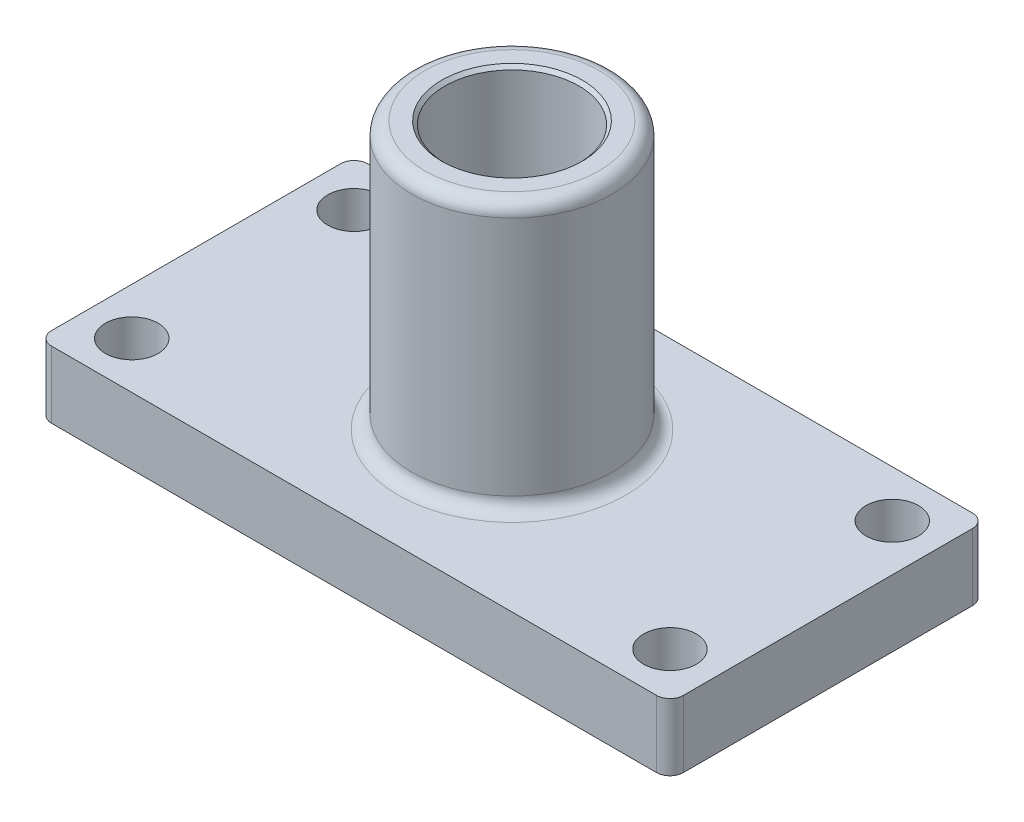
ISO-10303-21;
HEADER;
FILE_DESCRIPTION(('STEP AP214'),'2;1');
FILE_NAME('part.step','',(''),(''),'','','');
FILE_SCHEMA(('AUTOMOTIVE_DESIGN { 1 0 10303 214 1 1 1 1 }'));
ENDSEC;
DATA;
#1=APPLICATION_CONTEXT('core data for automotive mechanical design processes');
#2=APPLICATION_PROTOCOL_DEFINITION('international standard','automotive_design',2000,#1);
#3=PRODUCT_CONTEXT('',#1,'mechanical');
#4=PRODUCT('Part','Part','',(#3));
#5=PRODUCT_RELATED_PRODUCT_CATEGORY('part','',(#4));
#6=PRODUCT_DEFINITION_FORMATION('','',#4);
#7=PRODUCT_DEFINITION_CONTEXT('part definition',#1,'design');
#8=PRODUCT_DEFINITION('design','',#6,#7);
#9=PRODUCT_DEFINITION_SHAPE('','',#8);
#10=(LENGTH_UNIT() NAMED_UNIT(*) SI_UNIT(.MILLI.,.METRE.));
#11=(NAMED_UNIT(*) PLANE_ANGLE_UNIT() SI_UNIT($,.RADIAN.));
#12=(NAMED_UNIT(*) SI_UNIT($,.STERADIAN.) SOLID_ANGLE_UNIT());
#13=UNCERTAINTY_MEASURE_WITH_UNIT(LENGTH_MEASURE(1.E-05),#10,'distance_accuracy_value','');
#14=(GEOMETRIC_REPRESENTATION_CONTEXT(3) GLOBAL_UNCERTAINTY_ASSIGNED_CONTEXT((#13)) GLOBAL_UNIT_ASSIGNED_CONTEXT((#10,
#11,#12)) REPRESENTATION_CONTEXT('',''));
#15=CARTESIAN_POINT('',(0.,0.,0.));
#16=DIRECTION('',(0.,0.,1.));
#17=DIRECTION('',(1.,0.,0.));
#18=AXIS2_PLACEMENT_3D('',#15,#16,#17);
#19=CARTESIAN_POINT('',(0.,31.75,0.));
#20=DIRECTION('',(0.,1.,0.));
#21=DIRECTION('',(0.,0.,1.));
#22=AXIS2_PLACEMENT_3D('',#19,#20,#21);
#23=CONICAL_SURFACE('',#22,6.67639,0.785398163397451);
#24=CARTESIAN_POINT('',(0.,31.75,0.));
#25=DIRECTION('',(0.,1.,0.));
#26=DIRECTION('',(0.,0.,1.));
#27=AXIS2_PLACEMENT_3D('',#24,#25,#26);
#28=CIRCLE('',#27,6.67639);
#29=CARTESIAN_POINT('',(0.,31.75,6.67639));
#30=VERTEX_POINT('',#29);
#31=EDGE_CURVE('E56',#30,#30,#28,.F.);
#32=ORIENTED_EDGE('',*,*,#31,.F.);
#33=EDGE_LOOP('',(#32));
#34=FACE_BOUND('',#33,.T.);
#35=CARTESIAN_POINT('',(0.,31.4325,0.));
#36=DIRECTION('',(0.,1.,0.));
#37=DIRECTION('',(0.,0.,1.));
#38=AXIS2_PLACEMENT_3D('',#35,#36,#37);
#39=CIRCLE('',#38,6.35889);
#40=CARTESIAN_POINT('',(0.,31.4325,6.35889));
#41=VERTEX_POINT('',#40);
#42=EDGE_CURVE('E13',#41,#41,#39,.T.);
#43=ORIENTED_EDGE('',*,*,#42,.F.);
#44=EDGE_LOOP('',(#43));
#45=FACE_BOUND('',#44,.T.);
#46=ADVANCED_FACE('F51',(#34,#45),#23,.F.);
#47=CARTESIAN_POINT('',(0.,6.35,14.999999972));
#48=DIRECTION('',(0.,0.,-1.));
#49=DIRECTION('',(-1.,0.,0.));
#50=AXIS2_PLACEMENT_3D('',#47,#48,#49);
#51=PLANE('',#50);
#52=DIRECTION('',(1.,0.,0.));
#53=VECTOR('',#52,1.);
#54=CARTESIAN_POINT('',(0.,6.35,14.999999972));
#55=LINE('',#54,#53);
#56=CARTESIAN_POINT('',(-28.729999944,6.35,14.999999972));
#57=VERTEX_POINT('',#56);
#58=CARTESIAN_POINT('',(28.729999944,6.35,14.999999972));
#59=VERTEX_POINT('',#58);
#60=EDGE_CURVE('E222',#57,#59,#55,.T.);
#61=ORIENTED_EDGE('',*,*,#60,.F.);
#62=DIRECTION('',(0.,-1.,0.));
#63=VECTOR('',#62,1.);
#64=CARTESIAN_POINT('',(-28.729999944,0.,14.999999972));
#65=LINE('',#64,#63);
#66=CARTESIAN_POINT('',(-28.729999944,0.,14.999999972));
#67=VERTEX_POINT('',#66);
#68=EDGE_CURVE('E174',#57,#67,#65,.T.);
#69=ORIENTED_EDGE('',*,*,#68,.T.);
#70=DIRECTION('',(1.,0.,0.));
#71=VECTOR('',#70,1.);
#72=CARTESIAN_POINT('',(0.,0.,14.999999972));
#73=LINE('',#72,#71);
#74=CARTESIAN_POINT('',(28.729999944,0.,14.999999972));
#75=VERTEX_POINT('',#74);
#76=EDGE_CURVE('E125',#67,#75,#73,.T.);
#77=ORIENTED_EDGE('',*,*,#76,.T.);
#78=DIRECTION('',(0.,-1.,0.));
#79=VECTOR('',#78,1.);
#80=CARTESIAN_POINT('',(28.729999944,6.35,14.999999972));
#81=LINE('',#80,#79);
#82=EDGE_CURVE('E171',#75,#59,#81,.F.);
#83=ORIENTED_EDGE('',*,*,#82,.T.);
#84=EDGE_LOOP('',(#61,#69,#77,#83));
#85=FACE_BOUND('',#84,.T.);
#86=ADVANCED_FACE('F191',(#85),#51,.F.);
#87=CARTESIAN_POINT('',(29.999999944,6.35,0.));
#88=DIRECTION('',(-1.,0.,0.));
#89=DIRECTION('',(0.,0.,1.));
#90=AXIS2_PLACEMENT_3D('',#87,#88,#89);
#91=PLANE('',#90);
#92=DIRECTION('',(0.,0.,-1.));
#93=VECTOR('',#92,1.);
#94=CARTESIAN_POINT('',(29.999999944,0.,0.));
#95=LINE('',#94,#93);
#96=CARTESIAN_POINT('',(29.999999944,0.,13.729999972));
#97=VERTEX_POINT('',#96);
#98=CARTESIAN_POINT('',(29.999999944,0.,-13.729999972));
#99=VERTEX_POINT('',#98);
#100=EDGE_CURVE('E238',#97,#99,#95,.T.);
#101=ORIENTED_EDGE('',*,*,#100,.T.);
#102=DIRECTION('',(0.,-1.,0.));
#103=VECTOR('',#102,1.);
#104=CARTESIAN_POINT('',(29.999999944,6.35,-13.729999972));
#105=LINE('',#104,#103);
#106=CARTESIAN_POINT('',(29.999999944,6.35,-13.729999972));
#107=VERTEX_POINT('',#106);
#108=EDGE_CURVE('E68',#99,#107,#105,.F.);
#109=ORIENTED_EDGE('',*,*,#108,.T.);
#110=DIRECTION('',(0.,0.,-1.));
#111=VECTOR('',#110,1.);
#112=CARTESIAN_POINT('',(29.999999944,6.35,0.));
#113=LINE('',#112,#111);
#114=CARTESIAN_POINT('',(29.999999944,6.35,13.729999972));
#115=VERTEX_POINT('',#114);
#116=EDGE_CURVE('E224',#115,#107,#113,.T.);
#117=ORIENTED_EDGE('',*,*,#116,.F.);
#118=DIRECTION('',(0.,-1.,0.));
#119=VECTOR('',#118,1.);
#120=CARTESIAN_POINT('',(29.999999944,6.35,13.729999972));
#121=LINE('',#120,#119);
#122=EDGE_CURVE('E175',#115,#97,#121,.T.);
#123=ORIENTED_EDGE('',*,*,#122,.T.);
#124=EDGE_LOOP('',(#101,#109,#117,#123));
#125=FACE_BOUND('',#124,.T.);
#126=ADVANCED_FACE('F303',(#125),#91,.F.);
#127=CARTESIAN_POINT('',(0.,6.35,-14.999999972));
#128=DIRECTION('',(0.,0.,-1.));
#129=DIRECTION('',(-1.,0.,0.));
#130=AXIS2_PLACEMENT_3D('',#127,#128,#129);
#131=PLANE('',#130);
#132=DIRECTION('',(1.,0.,0.));
#133=VECTOR('',#132,1.);
#134=CARTESIAN_POINT('',(0.,0.,-14.999999972));
#135=LINE('',#134,#133);
#136=CARTESIAN_POINT('',(-28.729999944,0.,-14.999999972));
#137=VERTEX_POINT('',#136);
#138=CARTESIAN_POINT('',(28.729999944,0.,-14.999999972));
#139=VERTEX_POINT('',#138);
#140=EDGE_CURVE('E143',#137,#139,#135,.T.);
#141=ORIENTED_EDGE('',*,*,#140,.F.);
#142=DIRECTION('',(0.,-1.,0.));
#143=VECTOR('',#142,1.);
#144=CARTESIAN_POINT('',(-28.729999944,6.35,-14.999999972));
#145=LINE('',#144,#143);
#146=CARTESIAN_POINT('',(-28.729999944,6.35,-14.999999972));
#147=VERTEX_POINT('',#146);
#148=EDGE_CURVE('E159',#137,#147,#145,.F.);
#149=ORIENTED_EDGE('',*,*,#148,.T.);
#150=DIRECTION('',(1.,0.,0.));
#151=VECTOR('',#150,1.);
#152=CARTESIAN_POINT('',(0.,6.35,-14.999999972));
#153=LINE('',#152,#151);
#154=CARTESIAN_POINT('',(28.729999944,6.35,-14.999999972));
#155=VERTEX_POINT('',#154);
#156=EDGE_CURVE('E147',#147,#155,#153,.T.);
#157=ORIENTED_EDGE('',*,*,#156,.T.);
#158=DIRECTION('',(0.,-1.,0.));
#159=VECTOR('',#158,1.);
#160=CARTESIAN_POINT('',(28.729999944,0.,-14.999999972));
#161=LINE('',#160,#159);
#162=EDGE_CURVE('E160',#155,#139,#161,.T.);
#163=ORIENTED_EDGE('',*,*,#162,.T.);
#164=EDGE_LOOP('',(#141,#149,#157,#163));
#165=FACE_BOUND('',#164,.T.);
#166=ADVANCED_FACE('F249',(#165),#131,.T.);
#167=CARTESIAN_POINT('',(-29.999999944,6.35,0.));
#168=DIRECTION('',(-1.,0.,0.));
#169=DIRECTION('',(0.,0.,1.));
#170=AXIS2_PLACEMENT_3D('',#167,#168,#169);
#171=PLANE('',#170);
#172=DIRECTION('',(0.,0.,-1.));
#173=VECTOR('',#172,1.);
#174=CARTESIAN_POINT('',(-29.999999944,6.35,0.));
#175=LINE('',#174,#173);
#176=CARTESIAN_POINT('',(-29.999999944,6.35,13.729999972));
#177=VERTEX_POINT('',#176);
#178=CARTESIAN_POINT('',(-29.999999944,6.35,-13.729999972));
#179=VERTEX_POINT('',#178);
#180=EDGE_CURVE('E148',#177,#179,#175,.T.);
#181=ORIENTED_EDGE('',*,*,#180,.T.);
#182=DIRECTION('',(0.,-1.,0.));
#183=VECTOR('',#182,1.);
#184=CARTESIAN_POINT('',(-29.999999944,6.35,-13.729999972));
#185=LINE('',#184,#183);
#186=CARTESIAN_POINT('',(-29.999999944,0.,-13.729999972));
#187=VERTEX_POINT('',#186);
#188=EDGE_CURVE('E140',#179,#187,#185,.T.);
#189=ORIENTED_EDGE('',*,*,#188,.T.);
#190=DIRECTION('',(0.,0.,-1.));
#191=VECTOR('',#190,1.);
#192=CARTESIAN_POINT('',(-29.999999944,0.,0.));
#193=LINE('',#192,#191);
#194=CARTESIAN_POINT('',(-29.999999944,0.,13.729999972));
#195=VERTEX_POINT('',#194);
#196=EDGE_CURVE('E124',#195,#187,#193,.T.);
#197=ORIENTED_EDGE('',*,*,#196,.F.);
#198=DIRECTION('',(0.,-1.,0.));
#199=VECTOR('',#198,1.);
#200=CARTESIAN_POINT('',(-29.999999944,6.35,13.729999972));
#201=LINE('',#200,#199);
#202=EDGE_CURVE('E138',#195,#177,#201,.F.);
#203=ORIENTED_EDGE('',*,*,#202,.T.);
#204=EDGE_LOOP('',(#181,#189,#197,#203));
#205=FACE_BOUND('',#204,.T.);
#206=ADVANCED_FACE('F135',(#205),#171,.T.);
#207=CARTESIAN_POINT('',(25.554999944,6.35,10.554999972));
#208=DIRECTION('',(0.,-1.,0.));
#209=DIRECTION('',(0.,0.,-1.));
#210=AXIS2_PLACEMENT_3D('',#207,#208,#209);
#211=CYLINDRICAL_SURFACE('',#210,2.499999953);
#212=CARTESIAN_POINT('',(25.554999944,6.35,10.554999972));
#213=DIRECTION('',(0.,1.,0.));
#214=DIRECTION('',(0.,0.,1.));
#215=AXIS2_PLACEMENT_3D('',#212,#213,#214);
#216=CIRCLE('',#215,2.499999953);
#217=CARTESIAN_POINT('',(25.554999944,6.35,13.054999925));
#218=VERTEX_POINT('',#217);
#219=EDGE_CURVE('E217',#218,#218,#216,.T.);
#220=ORIENTED_EDGE('',*,*,#219,.T.);
#221=EDGE_LOOP('',(#220));
#222=FACE_BOUND('',#221,.T.);
#223=CARTESIAN_POINT('',(25.554999944,0.,10.554999972));
#224=DIRECTION('',(0.,1.,0.));
#225=DIRECTION('',(0.,0.,1.));
#226=AXIS2_PLACEMENT_3D('',#223,#224,#225);
#227=CIRCLE('',#226,2.499999953);
#228=CARTESIAN_POINT('',(25.554999944,0.,13.054999925));
#229=VERTEX_POINT('',#228);
#230=EDGE_CURVE('E237',#229,#229,#227,.T.);
#231=ORIENTED_EDGE('',*,*,#230,.F.);
#232=EDGE_LOOP('',(#231));
#233=FACE_BOUND('',#232,.T.);
#234=ADVANCED_FACE('F299',(#222,#233),#211,.F.);
#235=CARTESIAN_POINT('',(-25.554999944,6.35,10.554999972));
#236=DIRECTION('',(0.,-1.,0.));
#237=DIRECTION('',(0.,0.,-1.));
#238=AXIS2_PLACEMENT_3D('',#235,#236,#237);
#239=CYLINDRICAL_SURFACE('',#238,2.499999953);
#240=CARTESIAN_POINT('',(-25.554999944,6.35,10.554999972));
#241=DIRECTION('',(0.,1.,0.));
#242=DIRECTION('',(0.,0.,1.));
#243=AXIS2_PLACEMENT_3D('',#240,#241,#242);
#244=CIRCLE('',#243,2.499999953);
#245=CARTESIAN_POINT('',(-25.554999944,6.35,13.054999925));
#246=VERTEX_POINT('',#245);
#247=EDGE_CURVE('E213',#246,#246,#244,.T.);
#248=ORIENTED_EDGE('',*,*,#247,.T.);
#249=EDGE_LOOP('',(#248));
#250=FACE_BOUND('',#249,.T.);
#251=CARTESIAN_POINT('',(-25.554999944,0.,10.554999972));
#252=DIRECTION('',(0.,1.,0.));
#253=DIRECTION('',(0.,0.,1.));
#254=AXIS2_PLACEMENT_3D('',#251,#252,#253);
#255=CIRCLE('',#254,2.499999953);
#256=CARTESIAN_POINT('',(-25.554999944,0.,13.054999925));
#257=VERTEX_POINT('',#256);
#258=EDGE_CURVE('E232',#257,#257,#255,.T.);
#259=ORIENTED_EDGE('',*,*,#258,.F.);
#260=EDGE_LOOP('',(#259));
#261=FACE_BOUND('',#260,.T.);
#262=ADVANCED_FACE('F310',(#250,#261),#239,.F.);
#263=CARTESIAN_POINT('',(25.554999944,6.35,-10.554999972));
#264=DIRECTION('',(0.,-1.,0.));
#265=DIRECTION('',(0.,0.,-1.));
#266=AXIS2_PLACEMENT_3D('',#263,#264,#265);
#267=CYLINDRICAL_SURFACE('',#266,2.499999953);
#268=CARTESIAN_POINT('',(25.554999944,6.35,-10.554999972));
#269=DIRECTION('',(0.,1.,0.));
#270=DIRECTION('',(0.,0.,1.));
#271=AXIS2_PLACEMENT_3D('',#268,#269,#270);
#272=CIRCLE('',#271,2.499999953);
#273=CARTESIAN_POINT('',(25.554999944,6.35,-8.055000019));
#274=VERTEX_POINT('',#273);
#275=EDGE_CURVE('E208',#274,#274,#272,.T.);
#276=ORIENTED_EDGE('',*,*,#275,.T.);
#277=EDGE_LOOP('',(#276));
#278=FACE_BOUND('',#277,.T.);
#279=CARTESIAN_POINT('',(25.554999944,0.,-10.554999972));
#280=DIRECTION('',(0.,1.,0.));
#281=DIRECTION('',(0.,0.,1.));
#282=AXIS2_PLACEMENT_3D('',#279,#280,#281);
#283=CIRCLE('',#282,2.499999953);
#284=CARTESIAN_POINT('',(25.554999944,0.,-8.055000019));
#285=VERTEX_POINT('',#284);
#286=EDGE_CURVE('E230',#285,#285,#283,.T.);
#287=ORIENTED_EDGE('',*,*,#286,.F.);
#288=EDGE_LOOP('',(#287));
#289=FACE_BOUND('',#288,.T.);
#290=ADVANCED_FACE('F311',(#278,#289),#267,.F.);
#291=CARTESIAN_POINT('',(-25.554999944,6.35,-10.554999972));
#292=DIRECTION('',(0.,-1.,0.));
#293=DIRECTION('',(0.,0.,-1.));
#294=AXIS2_PLACEMENT_3D('',#291,#292,#293);
#295=CYLINDRICAL_SURFACE('',#294,2.499999953);
#296=CARTESIAN_POINT('',(-25.554999944,6.35,-10.554999972));
#297=DIRECTION('',(0.,1.,0.));
#298=DIRECTION('',(0.,0.,1.));
#299=AXIS2_PLACEMENT_3D('',#296,#297,#298);
#300=CIRCLE('',#299,2.499999953);
#301=CARTESIAN_POINT('',(-25.554999944,6.35,-8.055000019));
#302=VERTEX_POINT('',#301);
#303=EDGE_CURVE('E206',#302,#302,#300,.T.);
#304=ORIENTED_EDGE('',*,*,#303,.T.);
#305=EDGE_LOOP('',(#304));
#306=FACE_BOUND('',#305,.T.);
#307=CARTESIAN_POINT('',(-25.554999944,0.,-10.554999972));
#308=DIRECTION('',(0.,1.,0.));
#309=DIRECTION('',(0.,0.,1.));
#310=AXIS2_PLACEMENT_3D('',#307,#308,#309);
#311=CIRCLE('',#310,2.499999953);
#312=CARTESIAN_POINT('',(-25.554999944,0.,-8.055000019));
#313=VERTEX_POINT('',#312);
#314=EDGE_CURVE('E227',#313,#313,#311,.T.);
#315=ORIENTED_EDGE('',*,*,#314,.F.);
#316=EDGE_LOOP('',(#315));
#317=FACE_BOUND('',#316,.T.);
#318=ADVANCED_FACE('F205',(#306,#317),#295,.F.);
#319=CARTESIAN_POINT('',(0.,6.35,0.));
#320=DIRECTION('',(0.,-1.,0.));
#321=DIRECTION('',(0.,0.,-1.));
#322=AXIS2_PLACEMENT_3D('',#319,#320,#321);
#323=CYLINDRICAL_SURFACE('',#322,6.35889);
#324=ORIENTED_EDGE('',*,*,#42,.T.);
#325=EDGE_LOOP('',(#324));
#326=FACE_BOUND('',#325,.T.);
#327=CARTESIAN_POINT('',(0.,0.,0.));
#328=DIRECTION('',(0.,1.,0.));
#329=DIRECTION('',(0.,0.,1.));
#330=AXIS2_PLACEMENT_3D('',#327,#328,#329);
#331=CIRCLE('',#330,6.35889);
#332=CARTESIAN_POINT('',(0.,0.,6.35889));
#333=VERTEX_POINT('',#332);
#334=EDGE_CURVE('E136',#333,#333,#331,.T.);
#335=ORIENTED_EDGE('',*,*,#334,.F.);
#336=EDGE_LOOP('',(#335));
#337=FACE_BOUND('',#336,.T.);
#338=ADVANCED_FACE('F196',(#326,#337),#323,.F.);
#339=CARTESIAN_POINT('',(0.,6.35,0.));
#340=DIRECTION('',(0.,1.,0.));
#341=DIRECTION('',(0.,0.,1.));
#342=AXIS2_PLACEMENT_3D('',#339,#340,#341);
#343=PLANE('',#342);
#344=CARTESIAN_POINT('',(0.,6.35,0.));
#345=DIRECTION('',(0.,1.,0.));
#346=DIRECTION('',(0.,0.,1.));
#347=AXIS2_PLACEMENT_3D('',#344,#345,#346);
#348=CIRCLE('',#347,10.80389);
#349=CARTESIAN_POINT('',(0.,6.35,10.80389));
#350=VERTEX_POINT('',#349);
#351=EDGE_CURVE('E165',#350,#350,#348,.F.);
#352=ORIENTED_EDGE('',*,*,#351,.T.);
#353=EDGE_LOOP('',(#352));
#354=FACE_BOUND('',#353,.T.);
#355=ORIENTED_EDGE('',*,*,#303,.F.);
#356=EDGE_LOOP('',(#355));
#357=FACE_BOUND('',#356,.T.);
#358=ORIENTED_EDGE('',*,*,#275,.F.);
#359=EDGE_LOOP('',(#358));
#360=FACE_BOUND('',#359,.T.);
#361=ORIENTED_EDGE('',*,*,#247,.F.);
#362=EDGE_LOOP('',(#361));
#363=FACE_BOUND('',#362,.T.);
#364=ORIENTED_EDGE('',*,*,#219,.F.);
#365=EDGE_LOOP('',(#364));
#366=FACE_BOUND('',#365,.T.);
#367=ORIENTED_EDGE('',*,*,#156,.F.);
#368=CARTESIAN_POINT('',(-28.729999944,6.35,-13.729999972));
#369=DIRECTION('',(0.,1.,0.));
#370=DIRECTION('',(0.,0.,1.));
#371=AXIS2_PLACEMENT_3D('',#368,#369,#370);
#372=CIRCLE('',#371,1.27);
#373=EDGE_CURVE('E166',#147,#179,#372,.T.);
#374=ORIENTED_EDGE('',*,*,#373,.T.);
#375=ORIENTED_EDGE('',*,*,#180,.F.);
#376=CARTESIAN_POINT('',(-28.729999944,6.35,13.729999972));
#377=DIRECTION('',(0.,1.,0.));
#378=DIRECTION('',(0.,0.,1.));
#379=AXIS2_PLACEMENT_3D('',#376,#377,#378);
#380=CIRCLE('',#379,1.27);
#381=EDGE_CURVE('E144',#177,#57,#380,.T.);
#382=ORIENTED_EDGE('',*,*,#381,.T.);
#383=ORIENTED_EDGE('',*,*,#60,.T.);
#384=CARTESIAN_POINT('',(28.729999944,6.35,13.729999972));
#385=DIRECTION('',(0.,1.,0.));
#386=DIRECTION('',(0.,0.,1.));
#387=AXIS2_PLACEMENT_3D('',#384,#385,#386);
#388=CIRCLE('',#387,1.27);
#389=EDGE_CURVE('E71',#59,#115,#388,.T.);
#390=ORIENTED_EDGE('',*,*,#389,.T.);
#391=ORIENTED_EDGE('',*,*,#116,.T.);
#392=CARTESIAN_POINT('',(28.729999944,6.35,-13.729999972));
#393=DIRECTION('',(0.,1.,0.));
#394=DIRECTION('',(0.,0.,1.));
#395=AXIS2_PLACEMENT_3D('',#392,#393,#394);
#396=CIRCLE('',#395,1.27);
#397=EDGE_CURVE('E167',#107,#155,#396,.T.);
#398=ORIENTED_EDGE('',*,*,#397,.T.);
#399=EDGE_LOOP('',(#367,#374,#375,#382,#383,#390,#391,#398));
#400=FACE_BOUND('',#399,.T.);
#401=ADVANCED_FACE('F203',(#354,#357,#360,#363,#366,#400),#343,.T.);
#402=CARTESIAN_POINT('',(0.,0.,0.));
#403=DIRECTION('',(0.,1.,0.));
#404=DIRECTION('',(0.,0.,1.));
#405=AXIS2_PLACEMENT_3D('',#402,#403,#404);
#406=PLANE('',#405);
#407=ORIENTED_EDGE('',*,*,#314,.T.);
#408=EDGE_LOOP('',(#407));
#409=FACE_BOUND('',#408,.T.);
#410=ORIENTED_EDGE('',*,*,#286,.T.);
#411=EDGE_LOOP('',(#410));
#412=FACE_BOUND('',#411,.T.);
#413=ORIENTED_EDGE('',*,*,#258,.T.);
#414=EDGE_LOOP('',(#413));
#415=FACE_BOUND('',#414,.T.);
#416=ORIENTED_EDGE('',*,*,#230,.T.);
#417=EDGE_LOOP('',(#416));
#418=FACE_BOUND('',#417,.T.);
#419=ORIENTED_EDGE('',*,*,#196,.T.);
#420=CARTESIAN_POINT('',(-28.729999944,0.,-13.729999972));
#421=DIRECTION('',(0.,1.,0.));
#422=DIRECTION('',(0.,0.,1.));
#423=AXIS2_PLACEMENT_3D('',#420,#421,#422);
#424=CIRCLE('',#423,1.27);
#425=EDGE_CURVE('E129',#187,#137,#424,.F.);
#426=ORIENTED_EDGE('',*,*,#425,.T.);
#427=ORIENTED_EDGE('',*,*,#140,.T.);
#428=CARTESIAN_POINT('',(28.729999944,0.,-13.729999972));
#429=DIRECTION('',(0.,1.,0.));
#430=DIRECTION('',(0.,0.,1.));
#431=AXIS2_PLACEMENT_3D('',#428,#429,#430);
#432=CIRCLE('',#431,1.27);
#433=EDGE_CURVE('E128',#139,#99,#432,.F.);
#434=ORIENTED_EDGE('',*,*,#433,.T.);
#435=ORIENTED_EDGE('',*,*,#100,.F.);
#436=CARTESIAN_POINT('',(28.729999944,0.,13.729999972));
#437=DIRECTION('',(0.,1.,0.));
#438=DIRECTION('',(0.,0.,1.));
#439=AXIS2_PLACEMENT_3D('',#436,#437,#438);
#440=CIRCLE('',#439,1.27);
#441=EDGE_CURVE('E146',#97,#75,#440,.F.);
#442=ORIENTED_EDGE('',*,*,#441,.T.);
#443=ORIENTED_EDGE('',*,*,#76,.F.);
#444=CARTESIAN_POINT('',(-28.729999944,0.,13.729999972));
#445=DIRECTION('',(0.,1.,0.));
#446=DIRECTION('',(0.,0.,1.));
#447=AXIS2_PLACEMENT_3D('',#444,#445,#446);
#448=CIRCLE('',#447,1.27);
#449=EDGE_CURVE('E119',#67,#195,#448,.F.);
#450=ORIENTED_EDGE('',*,*,#449,.T.);
#451=EDGE_LOOP('',(#419,#426,#427,#434,#435,#442,#443,#450));
#452=FACE_BOUND('',#451,.T.);
#453=ORIENTED_EDGE('',*,*,#334,.T.);
#454=EDGE_LOOP('',(#453));
#455=FACE_BOUND('',#454,.T.);
#456=ADVANCED_FACE('F120',(#409,#412,#415,#418,#452,#455),#406,.F.);
#457=CARTESIAN_POINT('',(0.,31.75,0.));
#458=DIRECTION('',(0.,1.,0.));
#459=DIRECTION('',(0.,0.,1.));
#460=AXIS2_PLACEMENT_3D('',#457,#458,#459);
#461=PLANE('',#460);
#462=ORIENTED_EDGE('',*,*,#31,.T.);
#463=EDGE_LOOP('',(#462));
#464=FACE_BOUND('',#463,.T.);
#465=CARTESIAN_POINT('',(0.,31.75,0.));
#466=DIRECTION('',(0.,1.,0.));
#467=DIRECTION('',(0.,0.,1.));
#468=AXIS2_PLACEMENT_3D('',#465,#466,#467);
#469=CIRCLE('',#468,8.26389);
#470=CARTESIAN_POINT('',(0.,31.75,8.26389));
#471=VERTEX_POINT('',#470);
#472=EDGE_CURVE('E180',#471,#471,#469,.T.);
#473=ORIENTED_EDGE('',*,*,#472,.T.);
#474=EDGE_LOOP('',(#473));
#475=FACE_BOUND('',#474,.T.);
#476=ADVANCED_FACE('F190',(#464,#475),#461,.T.);
#477=CARTESIAN_POINT('',(0.,31.75,0.));
#478=DIRECTION('',(0.,-1.,0.));
#479=DIRECTION('',(0.,0.,-1.));
#480=AXIS2_PLACEMENT_3D('',#477,#478,#479);
#481=CYLINDRICAL_SURFACE('',#480,9.53389);
#482=CARTESIAN_POINT('',(0.,30.48,0.));
#483=DIRECTION('',(0.,1.,0.));
#484=DIRECTION('',(0.,0.,1.));
#485=AXIS2_PLACEMENT_3D('',#482,#483,#484);
#486=CIRCLE('',#485,9.53389);
#487=CARTESIAN_POINT('',(0.,30.48,9.53389));
#488=VERTEX_POINT('',#487);
#489=EDGE_CURVE('E183',#488,#488,#486,.F.);
#490=ORIENTED_EDGE('',*,*,#489,.T.);
#491=EDGE_LOOP('',(#490));
#492=FACE_BOUND('',#491,.T.);
#493=CARTESIAN_POINT('',(0.,7.62,0.));
#494=DIRECTION('',(0.,1.,0.));
#495=DIRECTION('',(0.,0.,1.));
#496=AXIS2_PLACEMENT_3D('',#493,#494,#495);
#497=CIRCLE('',#496,9.53389);
#498=CARTESIAN_POINT('',(0.,7.62,9.53389));
#499=VERTEX_POINT('',#498);
#500=EDGE_CURVE('E185',#499,#499,#497,.T.);
#501=ORIENTED_EDGE('',*,*,#500,.T.);
#502=EDGE_LOOP('',(#501));
#503=FACE_BOUND('',#502,.T.);
#504=ADVANCED_FACE('F278',(#492,#503),#481,.T.);
#505=CARTESIAN_POINT('',(-28.729999944,6.35,-13.729999972));
#506=DIRECTION('',(0.,-1.,0.));
#507=DIRECTION('',(0.,0.,-1.));
#508=AXIS2_PLACEMENT_3D('',#505,#506,#507);
#509=CYLINDRICAL_SURFACE('',#508,1.27);
#510=ORIENTED_EDGE('',*,*,#373,.F.);
#511=ORIENTED_EDGE('',*,*,#148,.F.);
#512=ORIENTED_EDGE('',*,*,#425,.F.);
#513=ORIENTED_EDGE('',*,*,#188,.F.);
#514=EDGE_LOOP('',(#510,#511,#512,#513));
#515=FACE_BOUND('',#514,.T.);
#516=ADVANCED_FACE('F252',(#515),#509,.T.);
#517=CARTESIAN_POINT('',(-28.729999944,6.35,13.729999972));
#518=DIRECTION('',(0.,1.,0.));
#519=DIRECTION('',(0.,0.,1.));
#520=AXIS2_PLACEMENT_3D('',#517,#518,#519);
#521=CYLINDRICAL_SURFACE('',#520,1.27);
#522=ORIENTED_EDGE('',*,*,#381,.F.);
#523=ORIENTED_EDGE('',*,*,#202,.F.);
#524=ORIENTED_EDGE('',*,*,#449,.F.);
#525=ORIENTED_EDGE('',*,*,#68,.F.);
#526=EDGE_LOOP('',(#522,#523,#524,#525));
#527=FACE_BOUND('',#526,.T.);
#528=ADVANCED_FACE('F145',(#527),#521,.T.);
#529=CARTESIAN_POINT('',(28.729999944,6.35,-13.729999972));
#530=DIRECTION('',(0.,1.,0.));
#531=DIRECTION('',(0.,0.,1.));
#532=AXIS2_PLACEMENT_3D('',#529,#530,#531);
#533=CYLINDRICAL_SURFACE('',#532,1.27);
#534=ORIENTED_EDGE('',*,*,#397,.F.);
#535=ORIENTED_EDGE('',*,*,#108,.F.);
#536=ORIENTED_EDGE('',*,*,#433,.F.);
#537=ORIENTED_EDGE('',*,*,#162,.F.);
#538=EDGE_LOOP('',(#534,#535,#536,#537));
#539=FACE_BOUND('',#538,.T.);
#540=ADVANCED_FACE('F254',(#539),#533,.T.);
#541=CARTESIAN_POINT('',(28.729999944,6.35,13.729999972));
#542=DIRECTION('',(0.,-1.,0.));
#543=DIRECTION('',(0.,0.,-1.));
#544=AXIS2_PLACEMENT_3D('',#541,#542,#543);
#545=CYLINDRICAL_SURFACE('',#544,1.27);
#546=ORIENTED_EDGE('',*,*,#389,.F.);
#547=ORIENTED_EDGE('',*,*,#82,.F.);
#548=ORIENTED_EDGE('',*,*,#441,.F.);
#549=ORIENTED_EDGE('',*,*,#122,.F.);
#550=EDGE_LOOP('',(#546,#547,#548,#549));
#551=FACE_BOUND('',#550,.T.);
#552=ADVANCED_FACE('F260',(#551),#545,.T.);
#553=CARTESIAN_POINT('',(0.,30.48,0.));
#554=DIRECTION('',(0.,1.,0.));
#555=DIRECTION('',(0.,0.,1.));
#556=AXIS2_PLACEMENT_3D('',#553,#554,#555);
#557=TOROIDAL_SURFACE('',#556,8.26389,1.27);
#558=ORIENTED_EDGE('',*,*,#489,.F.);
#559=EDGE_LOOP('',(#558));
#560=FACE_BOUND('',#559,.T.);
#561=ORIENTED_EDGE('',*,*,#472,.F.);
#562=EDGE_LOOP('',(#561));
#563=FACE_BOUND('',#562,.T.);
#564=ADVANCED_FACE('F263',(#560,#563),#557,.T.);
#565=CARTESIAN_POINT('',(0.,7.62,0.));
#566=DIRECTION('',(0.,1.,0.));
#567=DIRECTION('',(0.,0.,1.));
#568=AXIS2_PLACEMENT_3D('',#565,#566,#567);
#569=TOROIDAL_SURFACE('',#568,10.80389,1.27);
#570=ORIENTED_EDGE('',*,*,#351,.F.);
#571=EDGE_LOOP('',(#570));
#572=FACE_BOUND('',#571,.T.);
#573=ORIENTED_EDGE('',*,*,#500,.F.);
#574=EDGE_LOOP('',(#573));
#575=FACE_BOUND('',#574,.T.);
#576=ADVANCED_FACE('F269',(#572,#575),#569,.F.);
#577=CLOSED_SHELL('',(#46,#86,#126,#166,#206,#234,#262,#290,#318,#338,#401,#456,#476,#504,#516,
#528,#540,#552,#564,#576));
#578=MANIFOLD_SOLID_BREP('B2',#577);
#579=ADVANCED_BREP_SHAPE_REPRESENTATION('',(#18,#578),#14);
#580=SHAPE_DEFINITION_REPRESENTATION(#9,#579);
ENDSEC;
END-ISO-10303-21;
